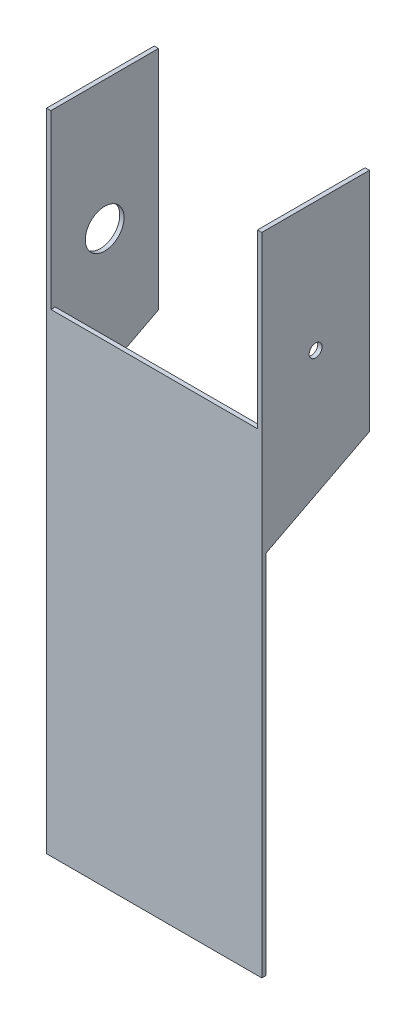
ISO-10303-21;
HEADER;
FILE_DESCRIPTION(('STEP AP214'),'2;1');
FILE_NAME('part.step','',(''),(''),'','','');
FILE_SCHEMA(('AUTOMOTIVE_DESIGN { 1 0 10303 214 1 1 1 1 }'));
ENDSEC;
DATA;
#1=APPLICATION_CONTEXT('core data for automotive mechanical design processes');
#2=APPLICATION_PROTOCOL_DEFINITION('international standard','automotive_design',2000,#1);
#3=PRODUCT_CONTEXT('',#1,'mechanical');
#4=PRODUCT('Part','Part','',(#3));
#5=PRODUCT_RELATED_PRODUCT_CATEGORY('part','',(#4));
#6=PRODUCT_DEFINITION_FORMATION('','',#4);
#7=PRODUCT_DEFINITION_CONTEXT('part definition',#1,'design');
#8=PRODUCT_DEFINITION('design','',#6,#7);
#9=PRODUCT_DEFINITION_SHAPE('','',#8);
#10=(LENGTH_UNIT() NAMED_UNIT(*) SI_UNIT(.MILLI.,.METRE.));
#11=(NAMED_UNIT(*) PLANE_ANGLE_UNIT() SI_UNIT($,.RADIAN.));
#12=(NAMED_UNIT(*) SI_UNIT($,.STERADIAN.) SOLID_ANGLE_UNIT());
#13=UNCERTAINTY_MEASURE_WITH_UNIT(LENGTH_MEASURE(1.E-05),#10,'distance_accuracy_value','');
#14=(GEOMETRIC_REPRESENTATION_CONTEXT(3) GLOBAL_UNCERTAINTY_ASSIGNED_CONTEXT((#13)) GLOBAL_UNIT_ASSIGNED_CONTEXT((#10,
#11,#12)) REPRESENTATION_CONTEXT('',''));
#15=CARTESIAN_POINT('',(0.,0.,0.));
#16=DIRECTION('',(0.,0.,1.));
#17=DIRECTION('',(1.,0.,0.));
#18=AXIS2_PLACEMENT_3D('',#15,#16,#17);
#19=CARTESIAN_POINT('',(0.,0.,0.));
#20=DIRECTION('',(0.,0.,1.));
#21=DIRECTION('',(1.,0.,0.));
#22=AXIS2_PLACEMENT_3D('',#19,#20,#21);
#23=PLANE('',#22);
#24=DIRECTION('',(0.,-1.,0.));
#25=VECTOR('',#24,1.);
#26=CARTESIAN_POINT('',(-31.8649051551098,52.5838482481757,0.));
#27=LINE('',#26,#25);
#28=CARTESIAN_POINT('',(-31.8649051551098,52.5838482481757,0.));
#29=VERTEX_POINT('',#28);
#30=CARTESIAN_POINT('',(-31.8649051551098,0.,0.));
#31=VERTEX_POINT('',#30);
#32=EDGE_CURVE('E157',#29,#31,#27,.T.);
#33=ORIENTED_EDGE('',*,*,#32,.T.);
#34=DIRECTION('',(-1.,0.,0.));
#35=VECTOR('',#34,1.);
#36=CARTESIAN_POINT('',(-31.8649051551098,0.,0.));
#37=LINE('',#36,#35);
#38=CARTESIAN_POINT('',(-32.8649051551098,0.,0.));
#39=VERTEX_POINT('',#38);
#40=EDGE_CURVE('E223',#31,#39,#37,.T.);
#41=ORIENTED_EDGE('',*,*,#40,.T.);
#42=DIRECTION('',(0.,-1.,0.));
#43=VECTOR('',#42,1.);
#44=CARTESIAN_POINT('',(-32.8649051551098,52.5838482481757,0.));
#45=LINE('',#44,#43);
#46=CARTESIAN_POINT('',(-32.8649051551098,52.5838482481757,0.));
#47=VERTEX_POINT('',#46);
#48=EDGE_CURVE('E170',#47,#39,#45,.T.);
#49=ORIENTED_EDGE('',*,*,#48,.F.);
#50=DIRECTION('',(-1.,0.,0.));
#51=VECTOR('',#50,1.);
#52=CARTESIAN_POINT('',(-32.8649051551098,52.5838482481757,0.));
#53=LINE('',#52,#51);
#54=EDGE_CURVE('E75',#29,#47,#53,.T.);
#55=ORIENTED_EDGE('',*,*,#54,.F.);
#56=EDGE_LOOP('',(#33,#41,#49,#55));
#57=FACE_BOUND('',#56,.T.);
#58=ADVANCED_FACE('F35',(#57),#23,.F.);
#59=CARTESIAN_POINT('',(-32.8649051551098,-97.4161517518243,25.));
#60=DIRECTION('',(0.,1.,0.));
#61=DIRECTION('',(0.,0.,1.));
#62=AXIS2_PLACEMENT_3D('',#59,#60,#61);
#63=PLANE('',#62);
#64=DIRECTION('',(1.,0.,0.));
#65=VECTOR('',#64,1.);
#66=CARTESIAN_POINT('',(-32.8649051551098,-97.4161517518243,24.));
#67=LINE('',#66,#65);
#68=CARTESIAN_POINT('',(-32.8649051551098,-97.4161517518243,24.));
#69=VERTEX_POINT('',#68);
#70=CARTESIAN_POINT('',(17.1350948448902,-97.4161517518243,24.));
#71=VERTEX_POINT('',#70);
#72=EDGE_CURVE('E163',#69,#71,#67,.T.);
#73=ORIENTED_EDGE('',*,*,#72,.T.);
#74=DIRECTION('',(0.,0.,-1.));
#75=VECTOR('',#74,1.);
#76=CARTESIAN_POINT('',(17.1350948448902,-97.4161517518243,25.));
#77=LINE('',#76,#75);
#78=CARTESIAN_POINT('',(17.1350948448902,-97.4161517518243,25.));
#79=VERTEX_POINT('',#78);
#80=EDGE_CURVE('E43',#79,#71,#77,.T.);
#81=ORIENTED_EDGE('',*,*,#80,.F.);
#82=DIRECTION('',(1.,0.,0.));
#83=VECTOR('',#82,1.);
#84=CARTESIAN_POINT('',(-32.8649051551098,-97.4161517518243,25.));
#85=LINE('',#84,#83);
#86=CARTESIAN_POINT('',(-32.8649051551098,-97.4161517518243,25.));
#87=VERTEX_POINT('',#86);
#88=EDGE_CURVE('E82',#87,#79,#85,.T.);
#89=ORIENTED_EDGE('',*,*,#88,.F.);
#90=DIRECTION('',(0.,0.,-1.));
#91=VECTOR('',#90,1.);
#92=CARTESIAN_POINT('',(-32.8649051551098,-97.4161517518243,25.));
#93=LINE('',#92,#91);
#94=EDGE_CURVE('E11',#87,#69,#93,.T.);
#95=ORIENTED_EDGE('',*,*,#94,.T.);
#96=EDGE_LOOP('',(#73,#81,#89,#95));
#97=FACE_BOUND('',#96,.T.);
#98=ADVANCED_FACE('F203',(#97),#63,.F.);
#99=CARTESIAN_POINT('',(-32.8649051551098,52.5838482481757,25.));
#100=DIRECTION('',(0.,-1.,0.));
#101=DIRECTION('',(0.,0.,-1.));
#102=AXIS2_PLACEMENT_3D('',#99,#100,#101);
#103=PLANE('',#102);
#104=DIRECTION('',(0.,0.,-1.));
#105=VECTOR('',#104,1.);
#106=CARTESIAN_POINT('',(-31.8649051551098,52.5838482481757,25.));
#107=LINE('',#106,#105);
#108=CARTESIAN_POINT('',(-31.8649051551098,52.5838482481757,25.));
#109=VERTEX_POINT('',#108);
#110=EDGE_CURVE('E171',#109,#29,#107,.T.);
#111=ORIENTED_EDGE('',*,*,#110,.T.);
#112=ORIENTED_EDGE('',*,*,#54,.T.);
#113=DIRECTION('',(0.,0.,-1.));
#114=VECTOR('',#113,1.);
#115=CARTESIAN_POINT('',(-32.8649051551098,52.5838482481757,25.));
#116=LINE('',#115,#114);
#117=CARTESIAN_POINT('',(-32.8649051551098,52.5838482481757,25.));
#118=VERTEX_POINT('',#117);
#119=EDGE_CURVE('E188',#118,#47,#116,.T.);
#120=ORIENTED_EDGE('',*,*,#119,.F.);
#121=DIRECTION('',(-1.,0.,0.));
#122=VECTOR('',#121,1.);
#123=CARTESIAN_POINT('',(-32.8649051551098,52.5838482481757,25.));
#124=LINE('',#123,#122);
#125=EDGE_CURVE('E59',#109,#118,#124,.T.);
#126=ORIENTED_EDGE('',*,*,#125,.F.);
#127=EDGE_LOOP('',(#111,#112,#120,#126));
#128=FACE_BOUND('',#127,.T.);
#129=ADVANCED_FACE('F255',(#128),#103,.F.);
#130=CARTESIAN_POINT('',(-32.8649051551098,52.5838482481757,25.));
#131=DIRECTION('',(1.,0.,0.));
#132=DIRECTION('',(0.,1.,0.));
#133=AXIS2_PLACEMENT_3D('',#130,#131,#132);
#134=PLANE('',#133);
#135=CARTESIAN_POINT('',(-32.8649051551098,22.5838482481757,12.5));
#136=DIRECTION('',(-1.,0.,0.));
#137=DIRECTION('',(0.,-1.,0.));
#138=AXIS2_PLACEMENT_3D('',#135,#136,#137);
#139=CIRCLE('',#138,4.5);
#140=CARTESIAN_POINT('',(-32.8649051551098,18.0838482481757,12.5));
#141=VERTEX_POINT('',#140);
#142=EDGE_CURVE('E226',#141,#141,#139,.T.);
#143=ORIENTED_EDGE('',*,*,#142,.F.);
#144=EDGE_LOOP('',(#143));
#145=FACE_BOUND('',#144,.T.);
#146=ORIENTED_EDGE('',*,*,#48,.T.);
#147=DIRECTION('',(0.,0.45949178156965,-0.888182021136405));
#148=VECTOR('',#147,1.);
#149=CARTESIAN_POINT('',(-32.8649051551098,0.,0.));
#150=LINE('',#149,#148);
#151=CARTESIAN_POINT('',(-32.8649051551098,-12.4161517518243,24.));
#152=VERTEX_POINT('',#151);
#153=EDGE_CURVE('E220',#152,#39,#150,.T.);
#154=ORIENTED_EDGE('',*,*,#153,.F.);
#155=DIRECTION('',(0.,1.,0.));
#156=VECTOR('',#155,1.);
#157=CARTESIAN_POINT('',(-32.8649051551098,-12.4161517518243,24.));
#158=LINE('',#157,#156);
#159=EDGE_CURVE('E216',#69,#152,#158,.T.);
#160=ORIENTED_EDGE('',*,*,#159,.F.);
#161=ORIENTED_EDGE('',*,*,#94,.F.);
#162=DIRECTION('',(0.,-1.,0.));
#163=VECTOR('',#162,1.);
#164=CARTESIAN_POINT('',(-32.8649051551098,52.5838482481757,25.));
#165=LINE('',#164,#163);
#166=EDGE_CURVE('E179',#118,#87,#165,.T.);
#167=ORIENTED_EDGE('',*,*,#166,.F.);
#168=ORIENTED_EDGE('',*,*,#119,.T.);
#169=EDGE_LOOP('',(#146,#154,#160,#161,#167,#168));
#170=FACE_BOUND('',#169,.T.);
#171=ADVANCED_FACE('F37',(#145,#170),#134,.F.);
#172=CARTESIAN_POINT('',(17.1350948448902,52.5838482481757,25.));
#173=DIRECTION('',(-1.,0.,0.));
#174=DIRECTION('',(0.,-1.,0.));
#175=AXIS2_PLACEMENT_3D('',#172,#173,#174);
#176=PLANE('',#175);
#177=CARTESIAN_POINT('',(17.1350948448902,22.5838482481757,12.5));
#178=DIRECTION('',(1.,0.,0.));
#179=DIRECTION('',(0.,1.,0.));
#180=AXIS2_PLACEMENT_3D('',#177,#178,#179);
#181=CIRCLE('',#180,1.5);
#182=CARTESIAN_POINT('',(17.1350948448902,24.0838482481757,12.5));
#183=VERTEX_POINT('',#182);
#184=EDGE_CURVE('E304',#183,#183,#181,.T.);
#185=ORIENTED_EDGE('',*,*,#184,.F.);
#186=EDGE_LOOP('',(#185));
#187=FACE_BOUND('',#186,.T.);
#188=ORIENTED_EDGE('',*,*,#80,.T.);
#189=DIRECTION('',(0.,-1.,0.));
#190=VECTOR('',#189,1.);
#191=CARTESIAN_POINT('',(17.1350948448902,0.,24.));
#192=LINE('',#191,#190);
#193=CARTESIAN_POINT('',(17.1350948448902,-12.4161517518243,24.));
#194=VERTEX_POINT('',#193);
#195=EDGE_CURVE('E143',#194,#71,#192,.T.);
#196=ORIENTED_EDGE('',*,*,#195,.F.);
#197=DIRECTION('',(0.,-0.459491781569651,0.888182021136404));
#198=VECTOR('',#197,1.);
#199=CARTESIAN_POINT('',(17.1350948448902,0.,0.));
#200=LINE('',#199,#198);
#201=CARTESIAN_POINT('',(17.1350948448902,0.,0.));
#202=VERTEX_POINT('',#201);
#203=EDGE_CURVE('E211',#202,#194,#200,.T.);
#204=ORIENTED_EDGE('',*,*,#203,.F.);
#205=DIRECTION('',(0.,1.,0.));
#206=VECTOR('',#205,1.);
#207=CARTESIAN_POINT('',(17.1350948448902,52.5838482481757,0.));
#208=LINE('',#207,#206);
#209=CARTESIAN_POINT('',(17.1350948448902,52.5838482481757,0.));
#210=VERTEX_POINT('',#209);
#211=EDGE_CURVE('E152',#202,#210,#208,.T.);
#212=ORIENTED_EDGE('',*,*,#211,.T.);
#213=DIRECTION('',(0.,0.,-1.));
#214=VECTOR('',#213,1.);
#215=CARTESIAN_POINT('',(17.1350948448902,52.5838482481757,25.));
#216=LINE('',#215,#214);
#217=CARTESIAN_POINT('',(17.1350948448902,52.5838482481757,25.));
#218=VERTEX_POINT('',#217);
#219=EDGE_CURVE('E194',#218,#210,#216,.T.);
#220=ORIENTED_EDGE('',*,*,#219,.F.);
#221=DIRECTION('',(0.,1.,0.));
#222=VECTOR('',#221,1.);
#223=CARTESIAN_POINT('',(17.1350948448902,52.5838482481757,25.));
#224=LINE('',#223,#222);
#225=EDGE_CURVE('E183',#79,#218,#224,.T.);
#226=ORIENTED_EDGE('',*,*,#225,.F.);
#227=EDGE_LOOP('',(#188,#196,#204,#212,#220,#226));
#228=FACE_BOUND('',#227,.T.);
#229=ADVANCED_FACE('F200',(#187,#228),#176,.F.);
#230=CARTESIAN_POINT('',(16.1350948448902,52.5838482481757,0.));
#231=VERTEX_POINT('',#230);
#232=EDGE_CURVE('E181',#210,#231,#53,.T.);
#233=ORIENTED_EDGE('',*,*,#232,.T.);
#234=DIRECTION('',(0.,0.,-1.));
#235=VECTOR('',#234,1.);
#236=CARTESIAN_POINT('',(16.1350948448902,52.5838482481757,25.));
#237=LINE('',#236,#235);
#238=CARTESIAN_POINT('',(16.1350948448902,52.5838482481757,25.));
#239=VERTEX_POINT('',#238);
#240=EDGE_CURVE('E156',#239,#231,#237,.T.);
#241=ORIENTED_EDGE('',*,*,#240,.F.);
#242=EDGE_CURVE('E185',#218,#239,#124,.T.);
#243=ORIENTED_EDGE('',*,*,#242,.F.);
#244=ORIENTED_EDGE('',*,*,#219,.T.);
#245=EDGE_LOOP('',(#233,#241,#243,#244));
#246=FACE_BOUND('',#245,.T.);
#247=ADVANCED_FACE('F252',(#246),#103,.F.);
#248=CARTESIAN_POINT('',(0.,0.,25.));
#249=DIRECTION('',(0.,0.,1.));
#250=DIRECTION('',(1.,0.,0.));
#251=AXIS2_PLACEMENT_3D('',#248,#249,#250);
#252=PLANE('',#251);
#253=DIRECTION('',(0.,-1.,0.));
#254=VECTOR('',#253,1.);
#255=CARTESIAN_POINT('',(16.1350948448902,52.5838482481757,25.));
#256=LINE('',#255,#254);
#257=CARTESIAN_POINT('',(16.1350948448902,12.5838482481757,25.));
#258=VERTEX_POINT('',#257);
#259=EDGE_CURVE('E161',#239,#258,#256,.T.);
#260=ORIENTED_EDGE('',*,*,#259,.T.);
#261=DIRECTION('',(1.,0.,0.));
#262=VECTOR('',#261,1.);
#263=CARTESIAN_POINT('',(-31.8649051551098,12.5838482481757,25.));
#264=LINE('',#263,#262);
#265=CARTESIAN_POINT('',(-31.8649051551098,12.5838482481757,25.));
#266=VERTEX_POINT('',#265);
#267=EDGE_CURVE('E239',#266,#258,#264,.T.);
#268=ORIENTED_EDGE('',*,*,#267,.F.);
#269=DIRECTION('',(0.,-1.,0.));
#270=VECTOR('',#269,1.);
#271=CARTESIAN_POINT('',(-31.8649051551098,52.5838482481757,25.));
#272=LINE('',#271,#270);
#273=EDGE_CURVE('E166',#109,#266,#272,.T.);
#274=ORIENTED_EDGE('',*,*,#273,.F.);
#275=ORIENTED_EDGE('',*,*,#125,.T.);
#276=ORIENTED_EDGE('',*,*,#166,.T.);
#277=ORIENTED_EDGE('',*,*,#88,.T.);
#278=ORIENTED_EDGE('',*,*,#225,.T.);
#279=ORIENTED_EDGE('',*,*,#242,.T.);
#280=EDGE_LOOP('',(#260,#268,#274,#275,#276,#277,#278,#279));
#281=FACE_BOUND('',#280,.T.);
#282=ADVANCED_FACE('F249',(#281),#252,.T.);
#283=ORIENTED_EDGE('',*,*,#211,.F.);
#284=DIRECTION('',(1.,0.,0.));
#285=VECTOR('',#284,1.);
#286=CARTESIAN_POINT('',(16.1350948448902,0.,0.));
#287=LINE('',#286,#285);
#288=CARTESIAN_POINT('',(16.1350948448902,0.,0.));
#289=VERTEX_POINT('',#288);
#290=EDGE_CURVE('E137',#289,#202,#287,.T.);
#291=ORIENTED_EDGE('',*,*,#290,.F.);
#292=DIRECTION('',(0.,-1.,0.));
#293=VECTOR('',#292,1.);
#294=CARTESIAN_POINT('',(16.1350948448902,52.5838482481757,0.));
#295=LINE('',#294,#293);
#296=EDGE_CURVE('E150',#231,#289,#295,.T.);
#297=ORIENTED_EDGE('',*,*,#296,.F.);
#298=ORIENTED_EDGE('',*,*,#232,.F.);
#299=EDGE_LOOP('',(#283,#291,#297,#298));
#300=FACE_BOUND('',#299,.T.);
#301=ADVANCED_FACE('F148',(#300),#23,.F.);
#302=CARTESIAN_POINT('',(16.1350948448902,52.5838482481757,25.));
#303=DIRECTION('',(1.,0.,0.));
#304=DIRECTION('',(0.,0.,-1.));
#305=AXIS2_PLACEMENT_3D('',#302,#303,#304);
#306=PLANE('',#305);
#307=CARTESIAN_POINT('',(16.1350948448902,22.5838482481757,12.5));
#308=DIRECTION('',(1.,0.,0.));
#309=DIRECTION('',(0.,1.,0.));
#310=AXIS2_PLACEMENT_3D('',#307,#308,#309);
#311=CIRCLE('',#310,1.5);
#312=CARTESIAN_POINT('',(16.1350948448902,24.0838482481757,12.5));
#313=VERTEX_POINT('',#312);
#314=EDGE_CURVE('E213',#313,#313,#311,.T.);
#315=ORIENTED_EDGE('',*,*,#314,.T.);
#316=EDGE_LOOP('',(#315));
#317=FACE_BOUND('',#316,.T.);
#318=ORIENTED_EDGE('',*,*,#296,.T.);
#319=DIRECTION('',(0.,-0.459491781569651,0.888182021136404));
#320=VECTOR('',#319,1.);
#321=CARTESIAN_POINT('',(16.1350948448902,0.,0.));
#322=LINE('',#321,#320);
#323=CARTESIAN_POINT('',(16.1350948448902,-12.4161517518243,24.));
#324=VERTEX_POINT('',#323);
#325=EDGE_CURVE('E133',#289,#324,#322,.T.);
#326=ORIENTED_EDGE('',*,*,#325,.T.);
#327=DIRECTION('',(0.,1.,0.));
#328=VECTOR('',#327,1.);
#329=CARTESIAN_POINT('',(16.1350948448902,52.5838482481757,24.));
#330=LINE('',#329,#328);
#331=CARTESIAN_POINT('',(16.1350948448902,12.5838482481757,24.));
#332=VERTEX_POINT('',#331);
#333=EDGE_CURVE('E158',#324,#332,#330,.T.);
#334=ORIENTED_EDGE('',*,*,#333,.T.);
#335=DIRECTION('',(0.,0.,-1.));
#336=VECTOR('',#335,1.);
#337=CARTESIAN_POINT('',(16.1350948448902,12.5838482481757,25.));
#338=LINE('',#337,#336);
#339=EDGE_CURVE('E176',#258,#332,#338,.T.);
#340=ORIENTED_EDGE('',*,*,#339,.F.);
#341=ORIENTED_EDGE('',*,*,#259,.F.);
#342=ORIENTED_EDGE('',*,*,#240,.T.);
#343=EDGE_LOOP('',(#318,#326,#334,#340,#341,#342));
#344=FACE_BOUND('',#343,.T.);
#345=ADVANCED_FACE('F154',(#317,#344),#306,.F.);
#346=CARTESIAN_POINT('',(-31.8649051551098,52.5838482481757,25.));
#347=DIRECTION('',(1.,0.,0.));
#348=DIRECTION('',(0.,0.,-1.));
#349=AXIS2_PLACEMENT_3D('',#346,#347,#348);
#350=PLANE('',#349);
#351=DIRECTION('',(0.,0.45949178156965,-0.888182021136405));
#352=VECTOR('',#351,1.);
#353=CARTESIAN_POINT('',(-31.8649051551098,0.,0.));
#354=LINE('',#353,#352);
#355=CARTESIAN_POINT('',(-31.8649051551098,-12.4161517518243,24.));
#356=VERTEX_POINT('',#355);
#357=EDGE_CURVE('E50',#356,#31,#354,.T.);
#358=ORIENTED_EDGE('',*,*,#357,.T.);
#359=ORIENTED_EDGE('',*,*,#32,.F.);
#360=ORIENTED_EDGE('',*,*,#110,.F.);
#361=ORIENTED_EDGE('',*,*,#273,.T.);
#362=DIRECTION('',(0.,0.,-1.));
#363=VECTOR('',#362,1.);
#364=CARTESIAN_POINT('',(-31.8649051551098,12.5838482481757,25.));
#365=LINE('',#364,#363);
#366=CARTESIAN_POINT('',(-31.8649051551098,12.5838482481757,24.));
#367=VERTEX_POINT('',#366);
#368=EDGE_CURVE('E173',#266,#367,#365,.T.);
#369=ORIENTED_EDGE('',*,*,#368,.T.);
#370=DIRECTION('',(0.,-1.,0.));
#371=VECTOR('',#370,1.);
#372=CARTESIAN_POINT('',(-31.8649051551098,52.5838482481757,24.));
#373=LINE('',#372,#371);
#374=EDGE_CURVE('E208',#367,#356,#373,.T.);
#375=ORIENTED_EDGE('',*,*,#374,.T.);
#376=EDGE_LOOP('',(#358,#359,#360,#361,#369,#375));
#377=FACE_BOUND('',#376,.T.);
#378=CARTESIAN_POINT('',(-31.8649051551098,22.5838482481757,12.5));
#379=DIRECTION('',(-1.,0.,0.));
#380=DIRECTION('',(0.,-1.,0.));
#381=AXIS2_PLACEMENT_3D('',#378,#379,#380);
#382=CIRCLE('',#381,4.5);
#383=CARTESIAN_POINT('',(-31.8649051551098,18.0838482481757,12.5));
#384=VERTEX_POINT('',#383);
#385=EDGE_CURVE('E228',#384,#384,#382,.T.);
#386=ORIENTED_EDGE('',*,*,#385,.T.);
#387=EDGE_LOOP('',(#386));
#388=FACE_BOUND('',#387,.T.);
#389=ADVANCED_FACE('F245',(#377,#388),#350,.T.);
#390=CARTESIAN_POINT('',(-31.8649051551098,12.5838482481757,25.));
#391=DIRECTION('',(0.,1.,0.));
#392=DIRECTION('',(0.,0.,1.));
#393=AXIS2_PLACEMENT_3D('',#390,#391,#392);
#394=PLANE('',#393);
#395=DIRECTION('',(1.,0.,0.));
#396=VECTOR('',#395,1.);
#397=CARTESIAN_POINT('',(-31.8649051551098,12.5838482481757,24.));
#398=LINE('',#397,#396);
#399=EDGE_CURVE('E231',#367,#332,#398,.T.);
#400=ORIENTED_EDGE('',*,*,#399,.F.);
#401=ORIENTED_EDGE('',*,*,#368,.F.);
#402=ORIENTED_EDGE('',*,*,#267,.T.);
#403=ORIENTED_EDGE('',*,*,#339,.T.);
#404=EDGE_LOOP('',(#400,#401,#402,#403));
#405=FACE_BOUND('',#404,.T.);
#406=ADVANCED_FACE('F248',(#405),#394,.T.);
#407=CARTESIAN_POINT('',(0.,0.,24.));
#408=DIRECTION('',(0.,0.,1.));
#409=DIRECTION('',(1.,0.,0.));
#410=AXIS2_PLACEMENT_3D('',#407,#408,#409);
#411=PLANE('',#410);
#412=ORIENTED_EDGE('',*,*,#333,.F.);
#413=DIRECTION('',(1.,0.,0.));
#414=VECTOR('',#413,1.);
#415=CARTESIAN_POINT('',(16.1350948448902,-12.4161517518243,24.));
#416=LINE('',#415,#414);
#417=EDGE_CURVE('E139',#324,#194,#416,.T.);
#418=ORIENTED_EDGE('',*,*,#417,.T.);
#419=ORIENTED_EDGE('',*,*,#195,.T.);
#420=ORIENTED_EDGE('',*,*,#72,.F.);
#421=ORIENTED_EDGE('',*,*,#159,.T.);
#422=DIRECTION('',(-1.,0.,0.));
#423=VECTOR('',#422,1.);
#424=CARTESIAN_POINT('',(-31.8649051551098,-12.4161517518243,24.));
#425=LINE('',#424,#423);
#426=EDGE_CURVE('E219',#356,#152,#425,.T.);
#427=ORIENTED_EDGE('',*,*,#426,.F.);
#428=ORIENTED_EDGE('',*,*,#374,.F.);
#429=ORIENTED_EDGE('',*,*,#399,.T.);
#430=EDGE_LOOP('',(#412,#418,#419,#420,#421,#427,#428,#429));
#431=FACE_BOUND('',#430,.T.);
#432=ADVANCED_FACE('F210',(#431),#411,.F.);
#433=CARTESIAN_POINT('',(-31.8649051551098,22.5838482481757,12.5));
#434=DIRECTION('',(-1.,0.,0.));
#435=DIRECTION('',(0.,-1.,0.));
#436=AXIS2_PLACEMENT_3D('',#433,#434,#435);
#437=CYLINDRICAL_SURFACE('',#436,4.5);
#438=ORIENTED_EDGE('',*,*,#385,.F.);
#439=EDGE_LOOP('',(#438));
#440=FACE_BOUND('',#439,.T.);
#441=ORIENTED_EDGE('',*,*,#142,.T.);
#442=EDGE_LOOP('',(#441));
#443=FACE_BOUND('',#442,.T.);
#444=ADVANCED_FACE('F286',(#440,#443),#437,.F.);
#445=CARTESIAN_POINT('',(-31.8649051551098,0.,0.));
#446=DIRECTION('',(0.,0.888182021136405,0.45949178156965));
#447=DIRECTION('',(0.,-0.45949178156965,0.888182021136405));
#448=AXIS2_PLACEMENT_3D('',#445,#446,#447);
#449=PLANE('',#448);
#450=ORIENTED_EDGE('',*,*,#153,.T.);
#451=ORIENTED_EDGE('',*,*,#40,.F.);
#452=ORIENTED_EDGE('',*,*,#357,.F.);
#453=ORIENTED_EDGE('',*,*,#426,.T.);
#454=EDGE_LOOP('',(#450,#451,#452,#453));
#455=FACE_BOUND('',#454,.T.);
#456=ADVANCED_FACE('F289',(#455),#449,.F.);
#457=CARTESIAN_POINT('',(16.1350948448902,0.,0.));
#458=DIRECTION('',(0.,0.888182021136404,0.459491781569651));
#459=DIRECTION('',(0.,-0.459491781569651,0.888182021136404));
#460=AXIS2_PLACEMENT_3D('',#457,#458,#459);
#461=PLANE('',#460);
#462=ORIENTED_EDGE('',*,*,#203,.T.);
#463=ORIENTED_EDGE('',*,*,#417,.F.);
#464=ORIENTED_EDGE('',*,*,#325,.F.);
#465=ORIENTED_EDGE('',*,*,#290,.T.);
#466=EDGE_LOOP('',(#462,#463,#464,#465));
#467=FACE_BOUND('',#466,.T.);
#468=ADVANCED_FACE('F136',(#467),#461,.F.);
#469=CARTESIAN_POINT('',(16.1350948448902,22.5838482481757,12.5));
#470=DIRECTION('',(1.,0.,0.));
#471=DIRECTION('',(0.,1.,0.));
#472=AXIS2_PLACEMENT_3D('',#469,#470,#471);
#473=CYLINDRICAL_SURFACE('',#472,1.5);
#474=ORIENTED_EDGE('',*,*,#314,.F.);
#475=EDGE_LOOP('',(#474));
#476=FACE_BOUND('',#475,.T.);
#477=ORIENTED_EDGE('',*,*,#184,.T.);
#478=EDGE_LOOP('',(#477));
#479=FACE_BOUND('',#478,.T.);
#480=ADVANCED_FACE('F295',(#476,#479),#473,.F.);
#481=CLOSED_SHELL('',(#58,#98,#129,#171,#229,#247,#282,#301,#345,#389,#406,#432,#444,#456,#468,#480));
#482=MANIFOLD_SOLID_BREP('B2',#481);
#483=ADVANCED_BREP_SHAPE_REPRESENTATION('',(#18,#482),#14);
#484=SHAPE_DEFINITION_REPRESENTATION(#9,#483);
ENDSEC;
END-ISO-10303-21;
